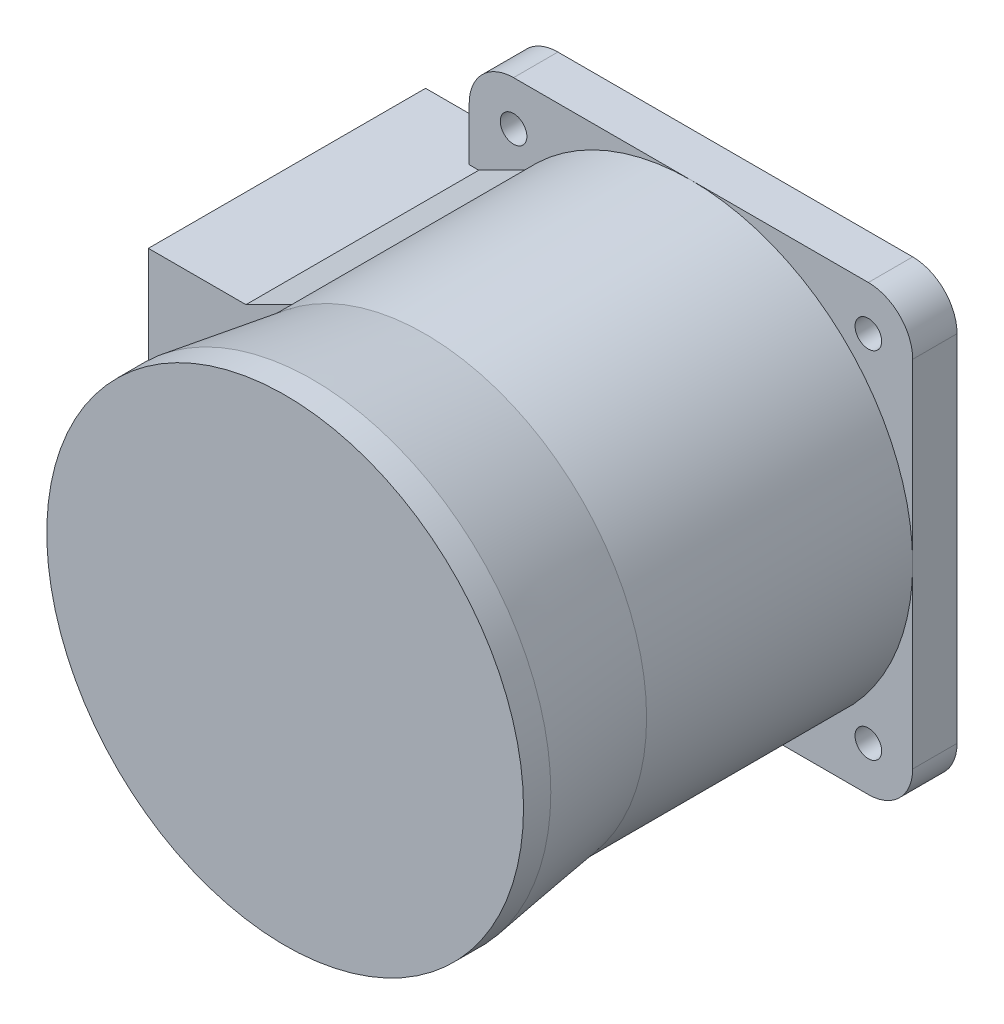
ISO-10303-21;
HEADER;
FILE_DESCRIPTION(('STEP AP214'),'2;1');
FILE_NAME('part.step','',(''),(''),'','','');
FILE_SCHEMA(('AUTOMOTIVE_DESIGN { 1 0 10303 214 1 1 1 1 }'));
ENDSEC;
DATA;
#1=APPLICATION_CONTEXT('core data for automotive mechanical design processes');
#2=APPLICATION_PROTOCOL_DEFINITION('international standard','automotive_design',2000,#1);
#3=PRODUCT_CONTEXT('',#1,'mechanical');
#4=PRODUCT('Part','Part','',(#3));
#5=PRODUCT_RELATED_PRODUCT_CATEGORY('part','',(#4));
#6=PRODUCT_DEFINITION_FORMATION('','',#4);
#7=PRODUCT_DEFINITION_CONTEXT('part definition',#1,'design');
#8=PRODUCT_DEFINITION('design','',#6,#7);
#9=PRODUCT_DEFINITION_SHAPE('','',#8);
#10=(LENGTH_UNIT() NAMED_UNIT(*) SI_UNIT(.MILLI.,.METRE.));
#11=(NAMED_UNIT(*) PLANE_ANGLE_UNIT() SI_UNIT($,.RADIAN.));
#12=(NAMED_UNIT(*) SI_UNIT($,.STERADIAN.) SOLID_ANGLE_UNIT());
#13=UNCERTAINTY_MEASURE_WITH_UNIT(LENGTH_MEASURE(1.E-05),#10,'distance_accuracy_value','');
#14=(GEOMETRIC_REPRESENTATION_CONTEXT(3) GLOBAL_UNCERTAINTY_ASSIGNED_CONTEXT((#13)) GLOBAL_UNIT_ASSIGNED_CONTEXT((#10,
#11,#12)) REPRESENTATION_CONTEXT('',''));
#15=CARTESIAN_POINT('',(0.,0.,0.));
#16=DIRECTION('',(0.,0.,1.));
#17=DIRECTION('',(1.,0.,0.));
#18=AXIS2_PLACEMENT_3D('',#15,#16,#17);
#19=CARTESIAN_POINT('',(80.,-80.,20.));
#20=DIRECTION('',(0.,0.,1.));
#21=DIRECTION('',(1.,0.,0.));
#22=AXIS2_PLACEMENT_3D('',#19,#20,#21);
#23=PLANE('',#22);
#24=CARTESIAN_POINT('',(-80.,-80.,20.));
#25=DIRECTION('',(0.,0.,1.));
#26=DIRECTION('',(-1.,0.,0.));
#27=AXIS2_PLACEMENT_3D('',#24,#25,#26);
#28=CIRCLE('',#27,6.);
#29=CARTESIAN_POINT('',(-86.,-80.,20.));
#30=VERTEX_POINT('',#29);
#31=EDGE_CURVE('E319',#30,#30,#28,.T.);
#32=ORIENTED_EDGE('',*,*,#31,.F.);
#33=EDGE_LOOP('',(#32));
#34=FACE_BOUND('',#33,.T.);
#35=DIRECTION('',(-0.894427190999916,0.447213595499958,0.));
#36=VECTOR('',#35,1.);
#37=CARTESIAN_POINT('',(54.4631328585945,-131.073734282811,20.));
#38=LINE('',#37,#36);
#39=CARTESIAN_POINT('',(-74.6843357070276,-66.5,20.));
#40=VERTEX_POINT('',#39);
#41=CARTESIAN_POINT('',(-95.6843357070276,-56.,20.));
#42=VERTEX_POINT('',#41);
#43=EDGE_CURVE('E182',#40,#42,#38,.T.);
#44=ORIENTED_EDGE('',*,*,#43,.T.);
#45=DIRECTION('',(-1.,0.,0.));
#46=VECTOR('',#45,1.);
#47=CARTESIAN_POINT('',(80.,-56.,20.));
#48=LINE('',#47,#46);
#49=CARTESIAN_POINT('',(-100.,-56.,20.));
#50=VERTEX_POINT('',#49);
#51=EDGE_CURVE('E192',#42,#50,#48,.T.);
#52=ORIENTED_EDGE('',*,*,#51,.T.);
#53=DIRECTION('',(0.,-1.,0.));
#54=VECTOR('',#53,1.);
#55=CARTESIAN_POINT('',(-100.,-79.9999999999999,20.));
#56=LINE('',#55,#54);
#57=CARTESIAN_POINT('',(-100.,-80.,20.));
#58=VERTEX_POINT('',#57);
#59=EDGE_CURVE('E345',#50,#58,#56,.T.);
#60=ORIENTED_EDGE('',*,*,#59,.T.);
#61=CARTESIAN_POINT('',(-80.,-80.,20.));
#62=DIRECTION('',(0.,0.,1.));
#63=DIRECTION('',(-1.,0.,0.));
#64=AXIS2_PLACEMENT_3D('',#61,#62,#63);
#65=CIRCLE('',#64,20.);
#66=CARTESIAN_POINT('',(-79.9999999999998,-100.,20.));
#67=VERTEX_POINT('',#66);
#68=EDGE_CURVE('E349',#58,#67,#65,.T.);
#69=ORIENTED_EDGE('',*,*,#68,.T.);
#70=DIRECTION('',(1.,0.,0.));
#71=VECTOR('',#70,1.);
#72=CARTESIAN_POINT('',(-79.9999999999998,-100.,20.));
#73=LINE('',#72,#71);
#74=CARTESIAN_POINT('',(0.,-100.,20.));
#75=VERTEX_POINT('',#74);
#76=EDGE_CURVE('E352',#67,#75,#73,.T.);
#77=ORIENTED_EDGE('',*,*,#76,.T.);
#78=CARTESIAN_POINT('',(0.,0.,20.));
#79=DIRECTION('',(0.,0.,1.));
#80=DIRECTION('',(1.,0.,0.));
#81=AXIS2_PLACEMENT_3D('',#78,#79,#80);
#82=CIRCLE('',#81,100.);
#83=EDGE_CURVE('E58',#40,#75,#82,.T.);
#84=ORIENTED_EDGE('',*,*,#83,.F.);
#85=EDGE_LOOP('',(#44,#52,#60,#69,#77,#84));
#86=FACE_BOUND('',#85,.T.);
#87=ADVANCED_FACE('F36',(#34,#86),#23,.T.);
#88=CARTESIAN_POINT('',(-100.,-79.9999999999999,20.));
#89=DIRECTION('',(1.,0.,0.));
#90=DIRECTION('',(0.,0.,-1.));
#91=AXIS2_PLACEMENT_3D('',#88,#89,#90);
#92=PLANE('',#91);
#93=DIRECTION('',(0.,0.,1.));
#94=VECTOR('',#93,1.);
#95=CARTESIAN_POINT('',(-100.,-56.,20.));
#96=LINE('',#95,#94);
#97=CARTESIAN_POINT('',(-100.,-56.,0.));
#98=VERTEX_POINT('',#97);
#99=EDGE_CURVE('E44',#98,#50,#96,.T.);
#100=ORIENTED_EDGE('',*,*,#99,.F.);
#101=DIRECTION('',(0.,-1.,0.));
#102=VECTOR('',#101,1.);
#103=CARTESIAN_POINT('',(-100.,-79.9999999999999,0.));
#104=LINE('',#103,#102);
#105=CARTESIAN_POINT('',(-100.,-80.,0.));
#106=VERTEX_POINT('',#105);
#107=EDGE_CURVE('E366',#98,#106,#104,.T.);
#108=ORIENTED_EDGE('',*,*,#107,.T.);
#109=DIRECTION('',(0.,0.,-1.));
#110=VECTOR('',#109,1.);
#111=CARTESIAN_POINT('',(-100.,-80.,20.));
#112=LINE('',#111,#110);
#113=EDGE_CURVE('E378',#58,#106,#112,.T.);
#114=ORIENTED_EDGE('',*,*,#113,.F.);
#115=ORIENTED_EDGE('',*,*,#59,.F.);
#116=EDGE_LOOP('',(#100,#108,#114,#115));
#117=FACE_BOUND('',#116,.T.);
#118=ADVANCED_FACE('F266',(#117),#92,.F.);
#119=CARTESIAN_POINT('',(100.,0.,20.));
#120=VERTEX_POINT('',#119);
#121=CARTESIAN_POINT('',(0.,100.,20.));
#122=VERTEX_POINT('',#121);
#123=EDGE_CURVE('E302',#120,#122,#82,.T.);
#124=ORIENTED_EDGE('',*,*,#123,.F.);
#125=DIRECTION('',(0.,1.,0.));
#126=VECTOR('',#125,1.);
#127=CARTESIAN_POINT('',(100.,-79.9999999999999,20.));
#128=LINE('',#127,#126);
#129=CARTESIAN_POINT('',(100.,79.9999999999999,20.));
#130=VERTEX_POINT('',#129);
#131=EDGE_CURVE('E334',#120,#130,#128,.T.);
#132=ORIENTED_EDGE('',*,*,#131,.T.);
#133=CARTESIAN_POINT('',(80.,80.,20.));
#134=DIRECTION('',(0.,0.,1.));
#135=DIRECTION('',(-1.,0.,0.));
#136=AXIS2_PLACEMENT_3D('',#133,#134,#135);
#137=CIRCLE('',#136,20.);
#138=CARTESIAN_POINT('',(79.9999999999999,100.,20.));
#139=VERTEX_POINT('',#138);
#140=EDGE_CURVE('E338',#130,#139,#137,.T.);
#141=ORIENTED_EDGE('',*,*,#140,.T.);
#142=DIRECTION('',(-1.,0.,0.));
#143=VECTOR('',#142,1.);
#144=CARTESIAN_POINT('',(-79.9999999999998,100.,20.));
#145=LINE('',#144,#143);
#146=EDGE_CURVE('E341',#139,#122,#145,.T.);
#147=ORIENTED_EDGE('',*,*,#146,.T.);
#148=EDGE_LOOP('',(#124,#132,#141,#147));
#149=FACE_BOUND('',#148,.T.);
#150=CARTESIAN_POINT('',(80.,80.,20.));
#151=DIRECTION('',(0.,0.,1.));
#152=DIRECTION('',(-1.,0.,0.));
#153=AXIS2_PLACEMENT_3D('',#150,#151,#152);
#154=CIRCLE('',#153,6.);
#155=CARTESIAN_POINT('',(74.,80.,20.));
#156=VERTEX_POINT('',#155);
#157=EDGE_CURVE('E305',#156,#156,#154,.T.);
#158=ORIENTED_EDGE('',*,*,#157,.F.);
#159=EDGE_LOOP('',(#158));
#160=FACE_BOUND('',#159,.T.);
#161=ADVANCED_FACE('F286',(#149,#160),#23,.T.);
#162=DIRECTION('',(-0.894427190999916,-0.447213595499958,0.));
#163=VECTOR('',#162,1.);
#164=CARTESIAN_POINT('',(-9.53686714140546,99.0737342828111,20.));
#165=LINE('',#164,#163);
#166=CARTESIAN_POINT('',(-74.6843357070276,66.5,20.));
#167=VERTEX_POINT('',#166);
#168=CARTESIAN_POINT('',(-95.6843357070276,56.,20.));
#169=VERTEX_POINT('',#168);
#170=EDGE_CURVE('E185',#167,#169,#165,.T.);
#171=ORIENTED_EDGE('',*,*,#170,.F.);
#172=EDGE_CURVE('E181',#122,#167,#82,.T.);
#173=ORIENTED_EDGE('',*,*,#172,.F.);
#174=CARTESIAN_POINT('',(-79.9999999999998,100.,20.));
#175=VERTEX_POINT('',#174);
#176=EDGE_CURVE('E340',#122,#175,#145,.T.);
#177=ORIENTED_EDGE('',*,*,#176,.T.);
#178=CARTESIAN_POINT('',(-80.,80.,20.));
#179=DIRECTION('',(0.,0.,1.));
#180=DIRECTION('',(-1.,0.,0.));
#181=AXIS2_PLACEMENT_3D('',#178,#179,#180);
#182=CIRCLE('',#181,20.);
#183=CARTESIAN_POINT('',(-100.,79.9999999999999,20.));
#184=VERTEX_POINT('',#183);
#185=EDGE_CURVE('E343',#175,#184,#182,.T.);
#186=ORIENTED_EDGE('',*,*,#185,.T.);
#187=CARTESIAN_POINT('',(-100.,56.,20.));
#188=VERTEX_POINT('',#187);
#189=EDGE_CURVE('E346',#184,#188,#56,.T.);
#190=ORIENTED_EDGE('',*,*,#189,.T.);
#191=DIRECTION('',(-1.,0.,0.));
#192=VECTOR('',#191,1.);
#193=CARTESIAN_POINT('',(80.,56.,20.));
#194=LINE('',#193,#192);
#195=EDGE_CURVE('E195',#169,#188,#194,.T.);
#196=ORIENTED_EDGE('',*,*,#195,.F.);
#197=EDGE_LOOP('',(#171,#173,#177,#186,#190,#196));
#198=FACE_BOUND('',#197,.T.);
#199=CARTESIAN_POINT('',(-80.,80.,20.));
#200=DIRECTION('',(0.,0.,1.));
#201=DIRECTION('',(1.,0.,0.));
#202=AXIS2_PLACEMENT_3D('',#199,#200,#201);
#203=CIRCLE('',#202,6.);
#204=CARTESIAN_POINT('',(-74.,80.,20.));
#205=VERTEX_POINT('',#204);
#206=EDGE_CURVE('E325',#205,#205,#203,.T.);
#207=ORIENTED_EDGE('',*,*,#206,.F.);
#208=EDGE_LOOP('',(#207));
#209=FACE_BOUND('',#208,.T.);
#210=ADVANCED_FACE('F249',(#198,#209),#23,.T.);
#211=EDGE_CURVE('E396',#75,#120,#82,.T.);
#212=ORIENTED_EDGE('',*,*,#211,.F.);
#213=CARTESIAN_POINT('',(79.9999999999999,-100.,20.));
#214=VERTEX_POINT('',#213);
#215=EDGE_CURVE('E351',#75,#214,#73,.T.);
#216=ORIENTED_EDGE('',*,*,#215,.T.);
#217=CARTESIAN_POINT('',(80.,-80.,20.));
#218=DIRECTION('',(0.,0.,1.));
#219=DIRECTION('',(1.,0.,0.));
#220=AXIS2_PLACEMENT_3D('',#217,#218,#219);
#221=CIRCLE('',#220,20.);
#222=CARTESIAN_POINT('',(100.,-79.9999999999999,20.));
#223=VERTEX_POINT('',#222);
#224=EDGE_CURVE('E331',#214,#223,#221,.T.);
#225=ORIENTED_EDGE('',*,*,#224,.T.);
#226=EDGE_CURVE('E336',#223,#120,#128,.T.);
#227=ORIENTED_EDGE('',*,*,#226,.T.);
#228=EDGE_LOOP('',(#212,#216,#225,#227));
#229=FACE_BOUND('',#228,.T.);
#230=CARTESIAN_POINT('',(80.,-80.,20.));
#231=DIRECTION('',(0.,0.,1.));
#232=DIRECTION('',(1.,0.,0.));
#233=AXIS2_PLACEMENT_3D('',#230,#231,#232);
#234=CIRCLE('',#233,6.);
#235=CARTESIAN_POINT('',(86.,-80.,20.));
#236=VERTEX_POINT('',#235);
#237=EDGE_CURVE('E310',#236,#236,#234,.T.);
#238=ORIENTED_EDGE('',*,*,#237,.F.);
#239=EDGE_LOOP('',(#238));
#240=FACE_BOUND('',#239,.T.);
#241=ADVANCED_FACE('F245',(#229,#240),#23,.T.);
#242=CARTESIAN_POINT('',(80.,-80.,0.));
#243=DIRECTION('',(0.,0.,1.));
#244=DIRECTION('',(1.,0.,0.));
#245=AXIS2_PLACEMENT_3D('',#242,#243,#244);
#246=PLANE('',#245);
#247=DIRECTION('',(1.,0.,0.));
#248=VECTOR('',#247,1.);
#249=CARTESIAN_POINT('',(0.,56.,0.));
#250=LINE('',#249,#248);
#251=CARTESIAN_POINT('',(-139.684335707028,56.,0.));
#252=VERTEX_POINT('',#251);
#253=CARTESIAN_POINT('',(-100.,56.,0.));
#254=VERTEX_POINT('',#253);
#255=EDGE_CURVE('E453',#252,#254,#250,.T.);
#256=ORIENTED_EDGE('',*,*,#255,.T.);
#257=CARTESIAN_POINT('',(-100.,79.9999999999999,0.));
#258=VERTEX_POINT('',#257);
#259=EDGE_CURVE('E367',#258,#254,#104,.T.);
#260=ORIENTED_EDGE('',*,*,#259,.F.);
#261=CARTESIAN_POINT('',(-80.,80.,0.));
#262=DIRECTION('',(0.,0.,1.));
#263=DIRECTION('',(-1.,0.,0.));
#264=AXIS2_PLACEMENT_3D('',#261,#262,#263);
#265=CIRCLE('',#264,20.);
#266=CARTESIAN_POINT('',(-79.9999999999998,100.,0.));
#267=VERTEX_POINT('',#266);
#268=EDGE_CURVE('E364',#267,#258,#265,.T.);
#269=ORIENTED_EDGE('',*,*,#268,.F.);
#270=DIRECTION('',(-1.,0.,0.));
#271=VECTOR('',#270,1.);
#272=CARTESIAN_POINT('',(-79.9999999999998,100.,0.));
#273=LINE('',#272,#271);
#274=CARTESIAN_POINT('',(79.9999999999999,100.,0.));
#275=VERTEX_POINT('',#274);
#276=EDGE_CURVE('E362',#275,#267,#273,.T.);
#277=ORIENTED_EDGE('',*,*,#276,.F.);
#278=CARTESIAN_POINT('',(80.,80.,0.));
#279=DIRECTION('',(0.,0.,1.));
#280=DIRECTION('',(-1.,0.,0.));
#281=AXIS2_PLACEMENT_3D('',#278,#279,#280);
#282=CIRCLE('',#281,20.);
#283=CARTESIAN_POINT('',(100.,79.9999999999999,0.));
#284=VERTEX_POINT('',#283);
#285=EDGE_CURVE('E360',#284,#275,#282,.T.);
#286=ORIENTED_EDGE('',*,*,#285,.F.);
#287=DIRECTION('',(0.,1.,0.));
#288=VECTOR('',#287,1.);
#289=CARTESIAN_POINT('',(100.,-79.9999999999999,0.));
#290=LINE('',#289,#288);
#291=CARTESIAN_POINT('',(100.,-79.9999999999999,0.));
#292=VERTEX_POINT('',#291);
#293=EDGE_CURVE('E358',#292,#284,#290,.T.);
#294=ORIENTED_EDGE('',*,*,#293,.F.);
#295=CARTESIAN_POINT('',(80.,-80.,0.));
#296=DIRECTION('',(0.,0.,1.));
#297=DIRECTION('',(1.,0.,0.));
#298=AXIS2_PLACEMENT_3D('',#295,#296,#297);
#299=CIRCLE('',#298,20.);
#300=CARTESIAN_POINT('',(79.9999999999999,-100.,0.));
#301=VERTEX_POINT('',#300);
#302=EDGE_CURVE('E328',#301,#292,#299,.T.);
#303=ORIENTED_EDGE('',*,*,#302,.F.);
#304=DIRECTION('',(1.,0.,0.));
#305=VECTOR('',#304,1.);
#306=CARTESIAN_POINT('',(-79.9999999999998,-100.,0.));
#307=LINE('',#306,#305);
#308=CARTESIAN_POINT('',(-79.9999999999998,-100.,0.));
#309=VERTEX_POINT('',#308);
#310=EDGE_CURVE('E335',#309,#301,#307,.T.);
#311=ORIENTED_EDGE('',*,*,#310,.F.);
#312=CARTESIAN_POINT('',(-80.,-80.,0.));
#313=DIRECTION('',(0.,0.,1.));
#314=DIRECTION('',(-1.,0.,0.));
#315=AXIS2_PLACEMENT_3D('',#312,#313,#314);
#316=CIRCLE('',#315,20.);
#317=EDGE_CURVE('E370',#106,#309,#316,.T.);
#318=ORIENTED_EDGE('',*,*,#317,.F.);
#319=ORIENTED_EDGE('',*,*,#107,.F.);
#320=DIRECTION('',(1.,0.,0.));
#321=VECTOR('',#320,1.);
#322=CARTESIAN_POINT('',(0.,-56.,0.));
#323=LINE('',#322,#321);
#324=CARTESIAN_POINT('',(-139.684335707028,-56.,0.));
#325=VERTEX_POINT('',#324);
#326=EDGE_CURVE('E168',#325,#98,#323,.T.);
#327=ORIENTED_EDGE('',*,*,#326,.F.);
#328=DIRECTION('',(0.,-1.,0.));
#329=VECTOR('',#328,1.);
#330=CARTESIAN_POINT('',(-139.684335707028,0.,0.));
#331=LINE('',#330,#329);
#332=EDGE_CURVE('E455',#252,#325,#331,.T.);
#333=ORIENTED_EDGE('',*,*,#332,.F.);
#334=EDGE_LOOP('',(#256,#260,#269,#277,#286,#294,#303,#311,#318,#319,#327,#333));
#335=FACE_BOUND('',#334,.T.);
#336=CARTESIAN_POINT('',(-80.,80.,0.));
#337=DIRECTION('',(0.,0.,1.));
#338=DIRECTION('',(1.,0.,0.));
#339=AXIS2_PLACEMENT_3D('',#336,#337,#338);
#340=CIRCLE('',#339,6.);
#341=CARTESIAN_POINT('',(-74.,80.,0.));
#342=VERTEX_POINT('',#341);
#343=EDGE_CURVE('E322',#342,#342,#340,.T.);
#344=ORIENTED_EDGE('',*,*,#343,.T.);
#345=EDGE_LOOP('',(#344));
#346=FACE_BOUND('',#345,.T.);
#347=CARTESIAN_POINT('',(-80.,-80.,0.));
#348=DIRECTION('',(0.,0.,1.));
#349=DIRECTION('',(-1.,0.,0.));
#350=AXIS2_PLACEMENT_3D('',#347,#348,#349);
#351=CIRCLE('',#350,6.);
#352=CARTESIAN_POINT('',(-86.,-80.,0.));
#353=VERTEX_POINT('',#352);
#354=EDGE_CURVE('E317',#353,#353,#351,.T.);
#355=ORIENTED_EDGE('',*,*,#354,.T.);
#356=EDGE_LOOP('',(#355));
#357=FACE_BOUND('',#356,.T.);
#358=CARTESIAN_POINT('',(80.,-80.,0.));
#359=DIRECTION('',(0.,0.,1.));
#360=DIRECTION('',(1.,0.,0.));
#361=AXIS2_PLACEMENT_3D('',#358,#359,#360);
#362=CIRCLE('',#361,6.);
#363=CARTESIAN_POINT('',(86.,-80.,0.));
#364=VERTEX_POINT('',#363);
#365=EDGE_CURVE('E306',#364,#364,#362,.T.);
#366=ORIENTED_EDGE('',*,*,#365,.T.);
#367=EDGE_LOOP('',(#366));
#368=FACE_BOUND('',#367,.T.);
#369=CARTESIAN_POINT('',(80.,80.,0.));
#370=DIRECTION('',(0.,0.,1.));
#371=DIRECTION('',(-1.,0.,0.));
#372=AXIS2_PLACEMENT_3D('',#369,#370,#371);
#373=CIRCLE('',#372,6.);
#374=CARTESIAN_POINT('',(74.,80.,0.));
#375=VERTEX_POINT('',#374);
#376=EDGE_CURVE('E307',#375,#375,#373,.T.);
#377=ORIENTED_EDGE('',*,*,#376,.T.);
#378=EDGE_LOOP('',(#377));
#379=FACE_BOUND('',#378,.T.);
#380=ADVANCED_FACE('F248',(#335,#346,#357,#368,#379),#246,.F.);
#381=CARTESIAN_POINT('',(80.,-80.,20.));
#382=DIRECTION('',(0.,0.,-1.));
#383=DIRECTION('',(-1.,0.,0.));
#384=AXIS2_PLACEMENT_3D('',#381,#382,#383);
#385=CYLINDRICAL_SURFACE('',#384,20.);
#386=ORIENTED_EDGE('',*,*,#302,.T.);
#387=DIRECTION('',(0.,0.,-1.));
#388=VECTOR('',#387,1.);
#389=CARTESIAN_POINT('',(100.,-79.9999999999999,20.));
#390=LINE('',#389,#388);
#391=EDGE_CURVE('E393',#223,#292,#390,.T.);
#392=ORIENTED_EDGE('',*,*,#391,.F.);
#393=ORIENTED_EDGE('',*,*,#224,.F.);
#394=DIRECTION('',(0.,0.,-1.));
#395=VECTOR('',#394,1.);
#396=CARTESIAN_POINT('',(79.9999999999999,-100.,20.));
#397=LINE('',#396,#395);
#398=EDGE_CURVE('E355',#214,#301,#397,.T.);
#399=ORIENTED_EDGE('',*,*,#398,.T.);
#400=EDGE_LOOP('',(#386,#392,#393,#399));
#401=FACE_BOUND('',#400,.T.);
#402=ADVANCED_FACE('F38',(#401),#385,.T.);
#403=CARTESIAN_POINT('',(100.,-79.9999999999999,20.));
#404=DIRECTION('',(-1.,0.,0.));
#405=DIRECTION('',(0.,0.,1.));
#406=AXIS2_PLACEMENT_3D('',#403,#404,#405);
#407=PLANE('',#406);
#408=ORIENTED_EDGE('',*,*,#293,.T.);
#409=DIRECTION('',(0.,0.,-1.));
#410=VECTOR('',#409,1.);
#411=CARTESIAN_POINT('',(100.,79.9999999999999,20.));
#412=LINE('',#411,#410);
#413=EDGE_CURVE('E390',#130,#284,#412,.T.);
#414=ORIENTED_EDGE('',*,*,#413,.F.);
#415=ORIENTED_EDGE('',*,*,#131,.F.);
#416=ORIENTED_EDGE('',*,*,#226,.F.);
#417=ORIENTED_EDGE('',*,*,#391,.T.);
#418=EDGE_LOOP('',(#408,#414,#415,#416,#417));
#419=FACE_BOUND('',#418,.T.);
#420=ADVANCED_FACE('F276',(#419),#407,.F.);
#421=CARTESIAN_POINT('',(80.,80.,20.));
#422=DIRECTION('',(0.,0.,-1.));
#423=DIRECTION('',(-1.,0.,0.));
#424=AXIS2_PLACEMENT_3D('',#421,#422,#423);
#425=CYLINDRICAL_SURFACE('',#424,20.);
#426=ORIENTED_EDGE('',*,*,#285,.T.);
#427=DIRECTION('',(0.,0.,-1.));
#428=VECTOR('',#427,1.);
#429=CARTESIAN_POINT('',(79.9999999999999,100.,20.));
#430=LINE('',#429,#428);
#431=EDGE_CURVE('E387',#139,#275,#430,.T.);
#432=ORIENTED_EDGE('',*,*,#431,.F.);
#433=ORIENTED_EDGE('',*,*,#140,.F.);
#434=ORIENTED_EDGE('',*,*,#413,.T.);
#435=EDGE_LOOP('',(#426,#432,#433,#434));
#436=FACE_BOUND('',#435,.T.);
#437=ADVANCED_FACE('F273',(#436),#425,.T.);
#438=CARTESIAN_POINT('',(-79.9999999999998,100.,20.));
#439=DIRECTION('',(0.,-1.,0.));
#440=DIRECTION('',(0.,0.,-1.));
#441=AXIS2_PLACEMENT_3D('',#438,#439,#440);
#442=PLANE('',#441);
#443=ORIENTED_EDGE('',*,*,#276,.T.);
#444=DIRECTION('',(0.,0.,-1.));
#445=VECTOR('',#444,1.);
#446=CARTESIAN_POINT('',(-79.9999999999998,100.,20.));
#447=LINE('',#446,#445);
#448=EDGE_CURVE('E384',#175,#267,#447,.T.);
#449=ORIENTED_EDGE('',*,*,#448,.F.);
#450=ORIENTED_EDGE('',*,*,#176,.F.);
#451=ORIENTED_EDGE('',*,*,#146,.F.);
#452=ORIENTED_EDGE('',*,*,#431,.T.);
#453=EDGE_LOOP('',(#443,#449,#450,#451,#452));
#454=FACE_BOUND('',#453,.T.);
#455=ADVANCED_FACE('F269',(#454),#442,.F.);
#456=CARTESIAN_POINT('',(-80.,80.,20.));
#457=DIRECTION('',(0.,0.,-1.));
#458=DIRECTION('',(-1.,0.,0.));
#459=AXIS2_PLACEMENT_3D('',#456,#457,#458);
#460=CYLINDRICAL_SURFACE('',#459,20.);
#461=ORIENTED_EDGE('',*,*,#268,.T.);
#462=DIRECTION('',(0.,0.,-1.));
#463=VECTOR('',#462,1.);
#464=CARTESIAN_POINT('',(-100.,79.9999999999999,20.));
#465=LINE('',#464,#463);
#466=EDGE_CURVE('E381',#184,#258,#465,.T.);
#467=ORIENTED_EDGE('',*,*,#466,.F.);
#468=ORIENTED_EDGE('',*,*,#185,.F.);
#469=ORIENTED_EDGE('',*,*,#448,.T.);
#470=EDGE_LOOP('',(#461,#467,#468,#469));
#471=FACE_BOUND('',#470,.T.);
#472=ADVANCED_FACE('F264',(#471),#460,.T.);
#473=ORIENTED_EDGE('',*,*,#259,.T.);
#474=DIRECTION('',(0.,0.,1.));
#475=VECTOR('',#474,1.);
#476=CARTESIAN_POINT('',(-100.,56.,20.));
#477=LINE('',#476,#475);
#478=EDGE_CURVE('E12',#254,#188,#477,.T.);
#479=ORIENTED_EDGE('',*,*,#478,.T.);
#480=ORIENTED_EDGE('',*,*,#189,.F.);
#481=ORIENTED_EDGE('',*,*,#466,.T.);
#482=EDGE_LOOP('',(#473,#479,#480,#481));
#483=FACE_BOUND('',#482,.T.);
#484=ADVANCED_FACE('F260',(#483),#92,.F.);
#485=CARTESIAN_POINT('',(-80.,-80.,20.));
#486=DIRECTION('',(0.,0.,-1.));
#487=DIRECTION('',(-1.,0.,0.));
#488=AXIS2_PLACEMENT_3D('',#485,#486,#487);
#489=CYLINDRICAL_SURFACE('',#488,20.);
#490=ORIENTED_EDGE('',*,*,#317,.T.);
#491=DIRECTION('',(0.,0.,-1.));
#492=VECTOR('',#491,1.);
#493=CARTESIAN_POINT('',(-79.9999999999998,-100.,20.));
#494=LINE('',#493,#492);
#495=EDGE_CURVE('E375',#67,#309,#494,.T.);
#496=ORIENTED_EDGE('',*,*,#495,.F.);
#497=ORIENTED_EDGE('',*,*,#68,.F.);
#498=ORIENTED_EDGE('',*,*,#113,.T.);
#499=EDGE_LOOP('',(#490,#496,#497,#498));
#500=FACE_BOUND('',#499,.T.);
#501=ADVANCED_FACE('F256',(#500),#489,.T.);
#502=CARTESIAN_POINT('',(-79.9999999999998,-100.,20.));
#503=DIRECTION('',(0.,1.,0.));
#504=DIRECTION('',(0.,0.,1.));
#505=AXIS2_PLACEMENT_3D('',#502,#503,#504);
#506=PLANE('',#505);
#507=ORIENTED_EDGE('',*,*,#310,.T.);
#508=ORIENTED_EDGE('',*,*,#398,.F.);
#509=ORIENTED_EDGE('',*,*,#215,.F.);
#510=ORIENTED_EDGE('',*,*,#76,.F.);
#511=ORIENTED_EDGE('',*,*,#495,.T.);
#512=EDGE_LOOP('',(#507,#508,#509,#510,#511));
#513=FACE_BOUND('',#512,.T.);
#514=ADVANCED_FACE('F243',(#513),#506,.F.);
#515=CARTESIAN_POINT('',(-80.,80.,20.));
#516=DIRECTION('',(0.,0.,-1.));
#517=DIRECTION('',(-1.,0.,0.));
#518=AXIS2_PLACEMENT_3D('',#515,#516,#517);
#519=CYLINDRICAL_SURFACE('',#518,6.);
#520=ORIENTED_EDGE('',*,*,#206,.T.);
#521=EDGE_LOOP('',(#520));
#522=FACE_BOUND('',#521,.T.);
#523=ORIENTED_EDGE('',*,*,#343,.F.);
#524=EDGE_LOOP('',(#523));
#525=FACE_BOUND('',#524,.T.);
#526=ADVANCED_FACE('F239',(#522,#525),#519,.F.);
#527=CARTESIAN_POINT('',(-80.,-80.,20.));
#528=DIRECTION('',(0.,0.,-1.));
#529=DIRECTION('',(-1.,0.,0.));
#530=AXIS2_PLACEMENT_3D('',#527,#528,#529);
#531=CYLINDRICAL_SURFACE('',#530,6.);
#532=ORIENTED_EDGE('',*,*,#31,.T.);
#533=EDGE_LOOP('',(#532));
#534=FACE_BOUND('',#533,.T.);
#535=ORIENTED_EDGE('',*,*,#354,.F.);
#536=EDGE_LOOP('',(#535));
#537=FACE_BOUND('',#536,.T.);
#538=ADVANCED_FACE('F235',(#534,#537),#531,.F.);
#539=CARTESIAN_POINT('',(80.,-80.,20.));
#540=DIRECTION('',(0.,0.,-1.));
#541=DIRECTION('',(-1.,0.,0.));
#542=AXIS2_PLACEMENT_3D('',#539,#540,#541);
#543=CYLINDRICAL_SURFACE('',#542,6.);
#544=ORIENTED_EDGE('',*,*,#237,.T.);
#545=EDGE_LOOP('',(#544));
#546=FACE_BOUND('',#545,.T.);
#547=ORIENTED_EDGE('',*,*,#365,.F.);
#548=EDGE_LOOP('',(#547));
#549=FACE_BOUND('',#548,.T.);
#550=ADVANCED_FACE('F231',(#546,#549),#543,.F.);
#551=CARTESIAN_POINT('',(80.,80.,20.));
#552=DIRECTION('',(0.,0.,-1.));
#553=DIRECTION('',(-1.,0.,0.));
#554=AXIS2_PLACEMENT_3D('',#551,#552,#553);
#555=CYLINDRICAL_SURFACE('',#554,6.);
#556=ORIENTED_EDGE('',*,*,#157,.T.);
#557=EDGE_LOOP('',(#556));
#558=FACE_BOUND('',#557,.T.);
#559=ORIENTED_EDGE('',*,*,#376,.F.);
#560=EDGE_LOOP('',(#559));
#561=FACE_BOUND('',#560,.T.);
#562=ADVANCED_FACE('F227',(#558,#561),#555,.F.);
#563=CARTESIAN_POINT('',(0.,0.,140.));
#564=DIRECTION('',(0.,0.,-1.));
#565=DIRECTION('',(-1.,0.,0.));
#566=AXIS2_PLACEMENT_3D('',#563,#564,#565);
#567=CYLINDRICAL_SURFACE('',#566,100.);
#568=CARTESIAN_POINT('',(0.,0.,140.));
#569=DIRECTION('',(0.,0.,1.));
#570=DIRECTION('',(1.,0.,0.));
#571=AXIS2_PLACEMENT_3D('',#568,#569,#570);
#572=CIRCLE('',#571,100.);
#573=CARTESIAN_POINT('',(100.,0.,140.));
#574=VERTEX_POINT('',#573);
#575=EDGE_CURVE('E313',#574,#574,#572,.T.);
#576=ORIENTED_EDGE('',*,*,#575,.F.);
#577=EDGE_LOOP('',(#576));
#578=FACE_BOUND('',#577,.T.);
#579=ORIENTED_EDGE('',*,*,#172,.T.);
#580=DIRECTION('',(0.,0.,-1.));
#581=VECTOR('',#580,1.);
#582=CARTESIAN_POINT('',(-74.6843357070276,66.5,125.));
#583=LINE('',#582,#581);
#584=CARTESIAN_POINT('',(-74.6843357070276,66.5,125.));
#585=VERTEX_POINT('',#584);
#586=EDGE_CURVE('E172',#585,#167,#583,.T.);
#587=ORIENTED_EDGE('',*,*,#586,.F.);
#588=CARTESIAN_POINT('',(0.,0.,125.));
#589=DIRECTION('',(0.,0.,1.));
#590=DIRECTION('',(1.,0.,0.));
#591=AXIS2_PLACEMENT_3D('',#588,#589,#590);
#592=CIRCLE('',#591,100.);
#593=CARTESIAN_POINT('',(-74.6843357070276,-66.5,125.));
#594=VERTEX_POINT('',#593);
#595=EDGE_CURVE('E160',#585,#594,#592,.T.);
#596=ORIENTED_EDGE('',*,*,#595,.T.);
#597=DIRECTION('',(0.,0.,-1.));
#598=VECTOR('',#597,1.);
#599=CARTESIAN_POINT('',(-74.6843357070276,-66.5,125.));
#600=LINE('',#599,#598);
#601=EDGE_CURVE('E51',#594,#40,#600,.T.);
#602=ORIENTED_EDGE('',*,*,#601,.T.);
#603=ORIENTED_EDGE('',*,*,#83,.T.);
#604=ORIENTED_EDGE('',*,*,#211,.T.);
#605=ORIENTED_EDGE('',*,*,#123,.T.);
#606=EDGE_LOOP('',(#579,#587,#596,#602,#603,#604,#605));
#607=FACE_BOUND('',#606,.T.);
#608=ADVANCED_FACE('F179',(#578,#607),#567,.T.);
#609=CARTESIAN_POINT('',(0.,0.,140.));
#610=DIRECTION('',(0.,0.,1.));
#611=DIRECTION('',(1.,0.,0.));
#612=AXIS2_PLACEMENT_3D('',#609,#610,#611);
#613=CONICAL_SURFACE('',#612,100.,0.146863901177664);
#614=ORIENTED_EDGE('',*,*,#575,.T.);
#615=EDGE_LOOP('',(#614));
#616=FACE_BOUND('',#615,.T.);
#617=CARTESIAN_POINT('',(0.,0.,190.7));
#618=DIRECTION('',(0.,0.,1.));
#619=DIRECTION('',(1.,0.,0.));
#620=AXIS2_PLACEMENT_3D('',#617,#618,#619);
#621=CIRCLE('',#620,107.5);
#622=CARTESIAN_POINT('',(107.5,0.,190.7));
#623=VERTEX_POINT('',#622);
#624=EDGE_CURVE('E200',#623,#623,#621,.T.);
#625=ORIENTED_EDGE('',*,*,#624,.F.);
#626=EDGE_LOOP('',(#625));
#627=FACE_BOUND('',#626,.T.);
#628=ADVANCED_FACE('F211',(#616,#627),#613,.T.);
#629=CARTESIAN_POINT('',(0.,0.,203.));
#630=DIRECTION('',(0.,0.,-1.));
#631=DIRECTION('',(-1.,0.,0.));
#632=AXIS2_PLACEMENT_3D('',#629,#630,#631);
#633=CYLINDRICAL_SURFACE('',#632,107.5);
#634=CARTESIAN_POINT('',(0.,0.,203.));
#635=DIRECTION('',(0.,0.,1.));
#636=DIRECTION('',(1.,0.,0.));
#637=AXIS2_PLACEMENT_3D('',#634,#635,#636);
#638=CIRCLE('',#637,107.5);
#639=CARTESIAN_POINT('',(107.5,0.,203.));
#640=VERTEX_POINT('',#639);
#641=EDGE_CURVE('E197',#640,#640,#638,.T.);
#642=ORIENTED_EDGE('',*,*,#641,.F.);
#643=EDGE_LOOP('',(#642));
#644=FACE_BOUND('',#643,.T.);
#645=ORIENTED_EDGE('',*,*,#624,.T.);
#646=EDGE_LOOP('',(#645));
#647=FACE_BOUND('',#646,.T.);
#648=ADVANCED_FACE('F221',(#644,#647),#633,.T.);
#649=CARTESIAN_POINT('',(0.,0.,203.));
#650=DIRECTION('',(0.,0.,1.));
#651=DIRECTION('',(1.,0.,0.));
#652=AXIS2_PLACEMENT_3D('',#649,#650,#651);
#653=PLANE('',#652);
#654=ORIENTED_EDGE('',*,*,#641,.T.);
#655=EDGE_LOOP('',(#654));
#656=FACE_BOUND('',#655,.T.);
#657=ADVANCED_FACE('F490',(#656),#653,.T.);
#658=CARTESIAN_POINT('',(-41.5368671414055,83.073734282811,125.));
#659=DIRECTION('',(-0.447213595499958,0.894427190999916,0.));
#660=DIRECTION('',(-0.894427190999916,-0.447213595499958,0.));
#661=AXIS2_PLACEMENT_3D('',#658,#659,#660);
#662=PLANE('',#661);
#663=ORIENTED_EDGE('',*,*,#586,.T.);
#664=ORIENTED_EDGE('',*,*,#170,.T.);
#665=DIRECTION('',(0.,0.,-1.));
#666=VECTOR('',#665,1.);
#667=CARTESIAN_POINT('',(-95.6843357070276,56.,125.));
#668=LINE('',#667,#666);
#669=CARTESIAN_POINT('',(-95.6843357070276,56.,125.));
#670=VERTEX_POINT('',#669);
#671=EDGE_CURVE('E175',#670,#169,#668,.T.);
#672=ORIENTED_EDGE('',*,*,#671,.F.);
#673=DIRECTION('',(0.894427190999916,0.447213595499958,0.));
#674=VECTOR('',#673,1.);
#675=CARTESIAN_POINT('',(-41.5368671414055,83.073734282811,125.));
#676=LINE('',#675,#674);
#677=EDGE_CURVE('E164',#670,#585,#676,.T.);
#678=ORIENTED_EDGE('',*,*,#677,.T.);
#679=EDGE_LOOP('',(#663,#664,#672,#678));
#680=FACE_BOUND('',#679,.T.);
#681=ADVANCED_FACE('F171',(#680),#662,.T.);
#682=CARTESIAN_POINT('',(0.,56.,125.));
#683=DIRECTION('',(0.,1.,0.));
#684=DIRECTION('',(0.,0.,1.));
#685=AXIS2_PLACEMENT_3D('',#682,#683,#684);
#686=PLANE('',#685);
#687=ORIENTED_EDGE('',*,*,#671,.T.);
#688=ORIENTED_EDGE('',*,*,#195,.T.);
#689=ORIENTED_EDGE('',*,*,#478,.F.);
#690=ORIENTED_EDGE('',*,*,#255,.F.);
#691=DIRECTION('',(0.,0.,-1.));
#692=VECTOR('',#691,1.);
#693=CARTESIAN_POINT('',(-139.684335707028,56.,125.));
#694=LINE('',#693,#692);
#695=CARTESIAN_POINT('',(-139.684335707028,56.,125.));
#696=VERTEX_POINT('',#695);
#697=EDGE_CURVE('E187',#696,#252,#694,.T.);
#698=ORIENTED_EDGE('',*,*,#697,.F.);
#699=DIRECTION('',(1.,0.,0.));
#700=VECTOR('',#699,1.);
#701=CARTESIAN_POINT('',(0.,56.,125.));
#702=LINE('',#701,#700);
#703=EDGE_CURVE('E176',#696,#670,#702,.T.);
#704=ORIENTED_EDGE('',*,*,#703,.T.);
#705=EDGE_LOOP('',(#687,#688,#689,#690,#698,#704));
#706=FACE_BOUND('',#705,.T.);
#707=ADVANCED_FACE('F443',(#706),#686,.T.);
#708=CARTESIAN_POINT('',(-139.684335707028,0.,125.));
#709=DIRECTION('',(1.,0.,0.));
#710=DIRECTION('',(0.,0.,-1.));
#711=AXIS2_PLACEMENT_3D('',#708,#709,#710);
#712=PLANE('',#711);
#713=ORIENTED_EDGE('',*,*,#332,.T.);
#714=DIRECTION('',(0.,0.,-1.));
#715=VECTOR('',#714,1.);
#716=CARTESIAN_POINT('',(-139.684335707028,-56.,125.));
#717=LINE('',#716,#715);
#718=CARTESIAN_POINT('',(-139.684335707028,-56.,125.));
#719=VERTEX_POINT('',#718);
#720=EDGE_CURVE('E462',#719,#325,#717,.T.);
#721=ORIENTED_EDGE('',*,*,#720,.F.);
#722=DIRECTION('',(0.,-1.,0.));
#723=VECTOR('',#722,1.);
#724=CARTESIAN_POINT('',(-139.684335707028,0.,125.));
#725=LINE('',#724,#723);
#726=EDGE_CURVE('E446',#696,#719,#725,.T.);
#727=ORIENTED_EDGE('',*,*,#726,.F.);
#728=ORIENTED_EDGE('',*,*,#697,.T.);
#729=EDGE_LOOP('',(#713,#721,#727,#728));
#730=FACE_BOUND('',#729,.T.);
#731=ADVANCED_FACE('F466',(#730),#712,.F.);
#732=CARTESIAN_POINT('',(0.,-56.,125.));
#733=DIRECTION('',(0.,1.,0.));
#734=DIRECTION('',(0.,0.,1.));
#735=AXIS2_PLACEMENT_3D('',#732,#733,#734);
#736=PLANE('',#735);
#737=ORIENTED_EDGE('',*,*,#51,.F.);
#738=DIRECTION('',(0.,0.,-1.));
#739=VECTOR('',#738,1.);
#740=CARTESIAN_POINT('',(-95.6843357070276,-56.,125.));
#741=LINE('',#740,#739);
#742=CARTESIAN_POINT('',(-95.6843357070276,-56.,125.));
#743=VERTEX_POINT('',#742);
#744=EDGE_CURVE('E459',#743,#42,#741,.T.);
#745=ORIENTED_EDGE('',*,*,#744,.F.);
#746=DIRECTION('',(1.,0.,0.));
#747=VECTOR('',#746,1.);
#748=CARTESIAN_POINT('',(0.,-56.,125.));
#749=LINE('',#748,#747);
#750=EDGE_CURVE('E448',#719,#743,#749,.T.);
#751=ORIENTED_EDGE('',*,*,#750,.F.);
#752=ORIENTED_EDGE('',*,*,#720,.T.);
#753=ORIENTED_EDGE('',*,*,#326,.T.);
#754=ORIENTED_EDGE('',*,*,#99,.T.);
#755=EDGE_LOOP('',(#737,#745,#751,#752,#753,#754));
#756=FACE_BOUND('',#755,.T.);
#757=ADVANCED_FACE('F472',(#756),#736,.F.);
#758=CARTESIAN_POINT('',(-41.5368671414055,-83.0737342828111,125.));
#759=DIRECTION('',(0.447213595499958,0.894427190999916,0.));
#760=DIRECTION('',(-0.894427190999916,0.447213595499958,0.));
#761=AXIS2_PLACEMENT_3D('',#758,#759,#760);
#762=PLANE('',#761);
#763=ORIENTED_EDGE('',*,*,#43,.F.);
#764=ORIENTED_EDGE('',*,*,#601,.F.);
#765=DIRECTION('',(0.894427190999916,-0.447213595499958,0.));
#766=VECTOR('',#765,1.);
#767=CARTESIAN_POINT('',(-41.5368671414055,-83.0737342828111,125.));
#768=LINE('',#767,#766);
#769=EDGE_CURVE('E166',#743,#594,#768,.T.);
#770=ORIENTED_EDGE('',*,*,#769,.F.);
#771=ORIENTED_EDGE('',*,*,#744,.T.);
#772=EDGE_LOOP('',(#763,#764,#770,#771));
#773=FACE_BOUND('',#772,.T.);
#774=ADVANCED_FACE('F475',(#773),#762,.F.);
#775=CARTESIAN_POINT('',(0.,0.,125.));
#776=DIRECTION('',(0.,0.,1.));
#777=DIRECTION('',(1.,0.,0.));
#778=AXIS2_PLACEMENT_3D('',#775,#776,#777);
#779=PLANE('',#778);
#780=ORIENTED_EDGE('',*,*,#595,.F.);
#781=ORIENTED_EDGE('',*,*,#677,.F.);
#782=ORIENTED_EDGE('',*,*,#703,.F.);
#783=ORIENTED_EDGE('',*,*,#726,.T.);
#784=ORIENTED_EDGE('',*,*,#750,.T.);
#785=ORIENTED_EDGE('',*,*,#769,.T.);
#786=EDGE_LOOP('',(#780,#781,#782,#783,#784,#785));
#787=FACE_BOUND('',#786,.T.);
#788=ADVANCED_FACE('F162',(#787),#779,.T.);
#789=CLOSED_SHELL('',(#87,#118,#161,#210,#241,#380,#402,#420,#437,#455,#472,#484,#501,#514,#526,
#538,#550,#562,#608,#628,#648,#657,#681,#707,#731,#757,#774,#788));
#790=MANIFOLD_SOLID_BREP('B2',#789);
#791=ADVANCED_BREP_SHAPE_REPRESENTATION('',(#18,#790),#14);
#792=SHAPE_DEFINITION_REPRESENTATION(#9,#791);
ENDSEC;
END-ISO-10303-21;
